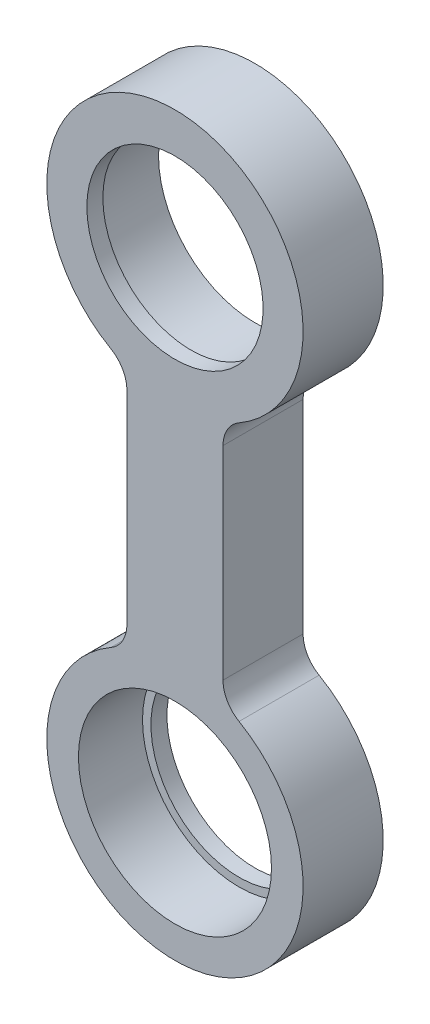
ISO-10303-21;
HEADER;
FILE_DESCRIPTION(('STEP AP214'),'2;1');
FILE_NAME('part.step','',(''),(''),'','','');
FILE_SCHEMA(('AUTOMOTIVE_DESIGN { 1 0 10303 214 1 1 1 1 }'));
ENDSEC;
DATA;
#1=APPLICATION_CONTEXT('core data for automotive mechanical design processes');
#2=APPLICATION_PROTOCOL_DEFINITION('international standard','automotive_design',2000,#1);
#3=PRODUCT_CONTEXT('',#1,'mechanical');
#4=PRODUCT('Part','Part','',(#3));
#5=PRODUCT_RELATED_PRODUCT_CATEGORY('part','',(#4));
#6=PRODUCT_DEFINITION_FORMATION('','',#4);
#7=PRODUCT_DEFINITION_CONTEXT('part definition',#1,'design');
#8=PRODUCT_DEFINITION('design','',#6,#7);
#9=PRODUCT_DEFINITION_SHAPE('','',#8);
#10=(LENGTH_UNIT() NAMED_UNIT(*) SI_UNIT(.MILLI.,.METRE.));
#11=(NAMED_UNIT(*) PLANE_ANGLE_UNIT() SI_UNIT($,.RADIAN.));
#12=(NAMED_UNIT(*) SI_UNIT($,.STERADIAN.) SOLID_ANGLE_UNIT());
#13=UNCERTAINTY_MEASURE_WITH_UNIT(LENGTH_MEASURE(1.E-05),#10,'distance_accuracy_value','');
#14=(GEOMETRIC_REPRESENTATION_CONTEXT(3) GLOBAL_UNCERTAINTY_ASSIGNED_CONTEXT((#13)) GLOBAL_UNIT_ASSIGNED_CONTEXT((#10,
#11,#12)) REPRESENTATION_CONTEXT('',''));
#15=CARTESIAN_POINT('',(0.,0.,0.));
#16=DIRECTION('',(0.,0.,1.));
#17=DIRECTION('',(1.,0.,0.));
#18=AXIS2_PLACEMENT_3D('',#15,#16,#17);
#19=CARTESIAN_POINT('',(0.,30.,5.));
#20=DIRECTION('',(0.,0.,-1.));
#21=DIRECTION('',(-1.,0.,0.));
#22=AXIS2_PLACEMENT_3D('',#19,#20,#21);
#23=CYLINDRICAL_SURFACE('',#22,8.);
#24=CARTESIAN_POINT('',(0.,30.,0.));
#25=DIRECTION('',(0.,0.,-1.));
#26=DIRECTION('',(-1.,0.,0.));
#27=AXIS2_PLACEMENT_3D('',#24,#25,#26);
#28=CIRCLE('',#27,8.);
#29=CARTESIAN_POINT('',(-4.,23.0717967697245,0.));
#30=VERTEX_POINT('',#29);
#31=CARTESIAN_POINT('',(4.,23.0717967697245,0.));
#32=VERTEX_POINT('',#31);
#33=EDGE_CURVE('E177',#30,#32,#28,.T.);
#34=ORIENTED_EDGE('',*,*,#33,.F.);
#35=DIRECTION('',(0.,0.,-1.));
#36=VECTOR('',#35,1.);
#37=CARTESIAN_POINT('',(-4.,23.0717967697245,5.));
#38=LINE('',#37,#36);
#39=CARTESIAN_POINT('',(-4.,23.0717967697245,5.));
#40=VERTEX_POINT('',#39);
#41=EDGE_CURVE('E138',#30,#40,#38,.F.);
#42=ORIENTED_EDGE('',*,*,#41,.T.);
#43=CARTESIAN_POINT('',(0.,30.,5.));
#44=DIRECTION('',(0.,0.,-1.));
#45=DIRECTION('',(-1.,0.,0.));
#46=AXIS2_PLACEMENT_3D('',#43,#44,#45);
#47=CIRCLE('',#46,8.);
#48=CARTESIAN_POINT('',(4.,23.0717967697245,5.));
#49=VERTEX_POINT('',#48);
#50=EDGE_CURVE('E125',#40,#49,#47,.T.);
#51=ORIENTED_EDGE('',*,*,#50,.T.);
#52=DIRECTION('',(0.,0.,-1.));
#53=VECTOR('',#52,1.);
#54=CARTESIAN_POINT('',(4.,23.0717967697245,5.));
#55=LINE('',#54,#53);
#56=EDGE_CURVE('E130',#49,#32,#55,.T.);
#57=ORIENTED_EDGE('',*,*,#56,.T.);
#58=EDGE_LOOP('',(#34,#42,#51,#57));
#59=FACE_BOUND('',#58,.T.);
#60=ADVANCED_FACE('F41',(#59),#23,.T.);
#61=CARTESIAN_POINT('',(-3.,7.41619848709566,5.));
#62=DIRECTION('',(-1.,0.,0.));
#63=DIRECTION('',(0.,-1.,0.));
#64=AXIS2_PLACEMENT_3D('',#61,#62,#63);
#65=PLANE('',#64);
#66=DIRECTION('',(0.,1.,0.));
#67=VECTOR('',#66,1.);
#68=CARTESIAN_POINT('',(-3.,7.41619848709566,5.));
#69=LINE('',#68,#67);
#70=CARTESIAN_POINT('',(-3.,8.66025403784439,5.));
#71=VERTEX_POINT('',#70);
#72=CARTESIAN_POINT('',(-3.,21.3397459621556,5.));
#73=VERTEX_POINT('',#72);
#74=EDGE_CURVE('E128',#71,#73,#69,.T.);
#75=ORIENTED_EDGE('',*,*,#74,.T.);
#76=DIRECTION('',(0.,0.,1.));
#77=VECTOR('',#76,1.);
#78=CARTESIAN_POINT('',(-3.,21.3397459621556,0.));
#79=LINE('',#78,#77);
#80=CARTESIAN_POINT('',(-3.,21.3397459621556,0.));
#81=VERTEX_POINT('',#80);
#82=EDGE_CURVE('E124',#73,#81,#79,.F.);
#83=ORIENTED_EDGE('',*,*,#82,.T.);
#84=DIRECTION('',(0.,1.,0.));
#85=VECTOR('',#84,1.);
#86=CARTESIAN_POINT('',(-3.,7.41619848709566,0.));
#87=LINE('',#86,#85);
#88=CARTESIAN_POINT('',(-3.,8.66025403784439,0.));
#89=VERTEX_POINT('',#88);
#90=EDGE_CURVE('E110',#89,#81,#87,.T.);
#91=ORIENTED_EDGE('',*,*,#90,.F.);
#92=DIRECTION('',(0.,0.,1.));
#93=VECTOR('',#92,1.);
#94=CARTESIAN_POINT('',(-3.,8.66025403784439,5.));
#95=LINE('',#94,#93);
#96=EDGE_CURVE('E122',#89,#71,#95,.T.);
#97=ORIENTED_EDGE('',*,*,#96,.T.);
#98=EDGE_LOOP('',(#75,#83,#91,#97));
#99=FACE_BOUND('',#98,.T.);
#100=ADVANCED_FACE('F121',(#99),#65,.T.);
#101=CARTESIAN_POINT('',(0.,0.,5.));
#102=DIRECTION('',(0.,0.,-1.));
#103=DIRECTION('',(-1.,0.,0.));
#104=AXIS2_PLACEMENT_3D('',#101,#102,#103);
#105=CYLINDRICAL_SURFACE('',#104,8.);
#106=CARTESIAN_POINT('',(0.,0.,5.));
#107=DIRECTION('',(0.,0.,-1.));
#108=DIRECTION('',(-1.,0.,0.));
#109=AXIS2_PLACEMENT_3D('',#106,#107,#108);
#110=CIRCLE('',#109,8.);
#111=CARTESIAN_POINT('',(4.,6.92820323027551,5.));
#112=VERTEX_POINT('',#111);
#113=CARTESIAN_POINT('',(-4.,6.92820323027551,5.));
#114=VERTEX_POINT('',#113);
#115=EDGE_CURVE('E132',#112,#114,#110,.T.);
#116=ORIENTED_EDGE('',*,*,#115,.T.);
#117=DIRECTION('',(0.,0.,-1.));
#118=VECTOR('',#117,1.);
#119=CARTESIAN_POINT('',(-4.,6.92820323027551,5.));
#120=LINE('',#119,#118);
#121=CARTESIAN_POINT('',(-4.,6.92820323027551,0.));
#122=VERTEX_POINT('',#121);
#123=EDGE_CURVE('E146',#114,#122,#120,.T.);
#124=ORIENTED_EDGE('',*,*,#123,.T.);
#125=CARTESIAN_POINT('',(0.,0.,0.));
#126=DIRECTION('',(0.,0.,-1.));
#127=DIRECTION('',(-1.,0.,0.));
#128=AXIS2_PLACEMENT_3D('',#125,#126,#127);
#129=CIRCLE('',#128,8.);
#130=CARTESIAN_POINT('',(4.,6.92820323027551,0.));
#131=VERTEX_POINT('',#130);
#132=EDGE_CURVE('E111',#131,#122,#129,.T.);
#133=ORIENTED_EDGE('',*,*,#132,.F.);
#134=DIRECTION('',(0.,0.,-1.));
#135=VECTOR('',#134,1.);
#136=CARTESIAN_POINT('',(4.,6.92820323027551,5.));
#137=LINE('',#136,#135);
#138=EDGE_CURVE('E63',#131,#112,#137,.F.);
#139=ORIENTED_EDGE('',*,*,#138,.T.);
#140=EDGE_LOOP('',(#116,#124,#133,#139));
#141=FACE_BOUND('',#140,.T.);
#142=ADVANCED_FACE('F160',(#141),#105,.T.);
#143=CARTESIAN_POINT('',(3.,22.5838015129043,5.));
#144=DIRECTION('',(1.,0.,0.));
#145=DIRECTION('',(0.,1.,0.));
#146=AXIS2_PLACEMENT_3D('',#143,#144,#145);
#147=PLANE('',#146);
#148=DIRECTION('',(0.,-1.,0.));
#149=VECTOR('',#148,1.);
#150=CARTESIAN_POINT('',(3.,22.5838015129043,0.));
#151=LINE('',#150,#149);
#152=CARTESIAN_POINT('',(3.,21.3397459621556,0.));
#153=VERTEX_POINT('',#152);
#154=CARTESIAN_POINT('',(3.,8.66025403784439,0.));
#155=VERTEX_POINT('',#154);
#156=EDGE_CURVE('E157',#153,#155,#151,.T.);
#157=ORIENTED_EDGE('',*,*,#156,.F.);
#158=DIRECTION('',(0.,0.,1.));
#159=VECTOR('',#158,1.);
#160=CARTESIAN_POINT('',(3.,21.3397459621556,5.));
#161=LINE('',#160,#159);
#162=CARTESIAN_POINT('',(3.,21.3397459621556,5.));
#163=VERTEX_POINT('',#162);
#164=EDGE_CURVE('E143',#153,#163,#161,.T.);
#165=ORIENTED_EDGE('',*,*,#164,.T.);
#166=DIRECTION('',(0.,-1.,0.));
#167=VECTOR('',#166,1.);
#168=CARTESIAN_POINT('',(3.,22.5838015129043,5.));
#169=LINE('',#168,#167);
#170=CARTESIAN_POINT('',(3.,8.66025403784439,5.));
#171=VERTEX_POINT('',#170);
#172=EDGE_CURVE('E166',#163,#171,#169,.T.);
#173=ORIENTED_EDGE('',*,*,#172,.T.);
#174=DIRECTION('',(0.,0.,1.));
#175=VECTOR('',#174,1.);
#176=CARTESIAN_POINT('',(3.,8.66025403784439,0.));
#177=LINE('',#176,#175);
#178=EDGE_CURVE('E140',#171,#155,#177,.F.);
#179=ORIENTED_EDGE('',*,*,#178,.T.);
#180=EDGE_LOOP('',(#157,#165,#173,#179));
#181=FACE_BOUND('',#180,.T.);
#182=ADVANCED_FACE('F169',(#181),#147,.T.);
#183=CARTESIAN_POINT('',(0.,30.,5.));
#184=DIRECTION('',(0.,0.,-1.));
#185=DIRECTION('',(-1.,0.,0.));
#186=AXIS2_PLACEMENT_3D('',#183,#184,#185);
#187=PLANE('',#186);
#188=CARTESIAN_POINT('',(0.,0.,5.));
#189=DIRECTION('',(0.,0.,1.));
#190=DIRECTION('',(1.,0.,0.));
#191=AXIS2_PLACEMENT_3D('',#188,#189,#190);
#192=CIRCLE('',#191,6.025);
#193=CARTESIAN_POINT('',(6.025,0.,5.));
#194=VERTEX_POINT('',#193);
#195=EDGE_CURVE('E204',#194,#194,#192,.T.);
#196=ORIENTED_EDGE('',*,*,#195,.F.);
#197=EDGE_LOOP('',(#196));
#198=FACE_BOUND('',#197,.T.);
#199=CARTESIAN_POINT('',(0.,30.,5.));
#200=DIRECTION('',(0.,0.,-1.));
#201=DIRECTION('',(-1.,0.,0.));
#202=AXIS2_PLACEMENT_3D('',#199,#200,#201);
#203=CIRCLE('',#202,5.50000000000001);
#204=CARTESIAN_POINT('',(-5.50000000000001,30.,5.));
#205=VERTEX_POINT('',#204);
#206=EDGE_CURVE('E180',#205,#205,#203,.T.);
#207=ORIENTED_EDGE('',*,*,#206,.T.);
#208=EDGE_LOOP('',(#207));
#209=FACE_BOUND('',#208,.T.);
#210=ORIENTED_EDGE('',*,*,#50,.F.);
#211=CARTESIAN_POINT('',(-5.,21.3397459621556,5.));
#212=DIRECTION('',(0.,0.,-1.));
#213=DIRECTION('',(-1.,0.,0.));
#214=AXIS2_PLACEMENT_3D('',#211,#212,#213);
#215=CIRCLE('',#214,2.);
#216=EDGE_CURVE('E150',#40,#73,#215,.T.);
#217=ORIENTED_EDGE('',*,*,#216,.T.);
#218=ORIENTED_EDGE('',*,*,#74,.F.);
#219=CARTESIAN_POINT('',(-5.,8.66025403784439,5.));
#220=DIRECTION('',(0.,0.,-1.));
#221=DIRECTION('',(-1.,0.,0.));
#222=AXIS2_PLACEMENT_3D('',#219,#220,#221);
#223=CIRCLE('',#222,2.);
#224=EDGE_CURVE('E56',#71,#114,#223,.T.);
#225=ORIENTED_EDGE('',*,*,#224,.T.);
#226=ORIENTED_EDGE('',*,*,#115,.F.);
#227=CARTESIAN_POINT('',(5.,8.66025403784439,5.));
#228=DIRECTION('',(0.,0.,-1.));
#229=DIRECTION('',(-1.,0.,0.));
#230=AXIS2_PLACEMENT_3D('',#227,#228,#229);
#231=CIRCLE('',#230,2.);
#232=EDGE_CURVE('E11',#112,#171,#231,.T.);
#233=ORIENTED_EDGE('',*,*,#232,.T.);
#234=ORIENTED_EDGE('',*,*,#172,.F.);
#235=CARTESIAN_POINT('',(5.,21.3397459621556,5.));
#236=DIRECTION('',(0.,0.,-1.));
#237=DIRECTION('',(-1.,0.,0.));
#238=AXIS2_PLACEMENT_3D('',#235,#236,#237);
#239=CIRCLE('',#238,2.);
#240=EDGE_CURVE('E116',#163,#49,#239,.T.);
#241=ORIENTED_EDGE('',*,*,#240,.T.);
#242=EDGE_LOOP('',(#210,#217,#218,#225,#226,#233,#234,#241));
#243=FACE_BOUND('',#242,.T.);
#244=ADVANCED_FACE('F165',(#198,#209,#243),#187,.F.);
#245=CARTESIAN_POINT('',(0.,30.,0.));
#246=DIRECTION('',(0.,0.,-1.));
#247=DIRECTION('',(-1.,0.,0.));
#248=AXIS2_PLACEMENT_3D('',#245,#246,#247);
#249=PLANE('',#248);
#250=CARTESIAN_POINT('',(0.,0.,0.));
#251=DIRECTION('',(0.,0.,1.));
#252=DIRECTION('',(1.,0.,0.));
#253=AXIS2_PLACEMENT_3D('',#250,#251,#252);
#254=CIRCLE('',#253,5.50000000000001);
#255=CARTESIAN_POINT('',(5.50000000000001,0.,0.));
#256=VERTEX_POINT('',#255);
#257=EDGE_CURVE('E195',#256,#256,#254,.T.);
#258=ORIENTED_EDGE('',*,*,#257,.T.);
#259=EDGE_LOOP('',(#258));
#260=FACE_BOUND('',#259,.T.);
#261=CARTESIAN_POINT('',(0.,30.,0.));
#262=DIRECTION('',(0.,0.,-1.));
#263=DIRECTION('',(-1.,0.,0.));
#264=AXIS2_PLACEMENT_3D('',#261,#262,#263);
#265=CIRCLE('',#264,6.025);
#266=CARTESIAN_POINT('',(-6.025,30.,0.));
#267=VERTEX_POINT('',#266);
#268=EDGE_CURVE('E192',#267,#267,#265,.T.);
#269=ORIENTED_EDGE('',*,*,#268,.F.);
#270=EDGE_LOOP('',(#269));
#271=FACE_BOUND('',#270,.T.);
#272=ORIENTED_EDGE('',*,*,#90,.T.);
#273=CARTESIAN_POINT('',(-5.,21.3397459621556,0.));
#274=DIRECTION('',(0.,0.,-1.));
#275=DIRECTION('',(-1.,0.,0.));
#276=AXIS2_PLACEMENT_3D('',#273,#274,#275);
#277=CIRCLE('',#276,2.);
#278=EDGE_CURVE('E148',#81,#30,#277,.F.);
#279=ORIENTED_EDGE('',*,*,#278,.T.);
#280=ORIENTED_EDGE('',*,*,#33,.T.);
#281=CARTESIAN_POINT('',(5.,21.3397459621556,0.));
#282=DIRECTION('',(0.,0.,-1.));
#283=DIRECTION('',(-1.,0.,0.));
#284=AXIS2_PLACEMENT_3D('',#281,#282,#283);
#285=CIRCLE('',#284,2.);
#286=EDGE_CURVE('E152',#32,#153,#285,.F.);
#287=ORIENTED_EDGE('',*,*,#286,.T.);
#288=ORIENTED_EDGE('',*,*,#156,.T.);
#289=CARTESIAN_POINT('',(5.,8.66025403784439,0.));
#290=DIRECTION('',(0.,0.,-1.));
#291=DIRECTION('',(-1.,0.,0.));
#292=AXIS2_PLACEMENT_3D('',#289,#290,#291);
#293=CIRCLE('',#292,2.);
#294=EDGE_CURVE('E49',#155,#131,#293,.F.);
#295=ORIENTED_EDGE('',*,*,#294,.T.);
#296=ORIENTED_EDGE('',*,*,#132,.T.);
#297=CARTESIAN_POINT('',(-5.,8.66025403784439,0.));
#298=DIRECTION('',(0.,0.,-1.));
#299=DIRECTION('',(-1.,0.,0.));
#300=AXIS2_PLACEMENT_3D('',#297,#298,#299);
#301=CIRCLE('',#300,2.);
#302=EDGE_CURVE('E107',#122,#89,#301,.F.);
#303=ORIENTED_EDGE('',*,*,#302,.T.);
#304=EDGE_LOOP('',(#272,#279,#280,#287,#288,#295,#296,#303));
#305=FACE_BOUND('',#304,.T.);
#306=ADVANCED_FACE('F109',(#260,#271,#305),#249,.T.);
#307=CARTESIAN_POINT('',(0.,30.,0.));
#308=DIRECTION('',(0.,0.,-1.));
#309=DIRECTION('',(-1.,0.,0.));
#310=AXIS2_PLACEMENT_3D('',#307,#308,#309);
#311=CYLINDRICAL_SURFACE('',#310,5.50000000000001);
#312=ORIENTED_EDGE('',*,*,#206,.F.);
#313=EDGE_LOOP('',(#312));
#314=FACE_BOUND('',#313,.T.);
#315=CARTESIAN_POINT('',(0.,30.,4.));
#316=DIRECTION('',(0.,0.,-1.));
#317=DIRECTION('',(-1.,0.,0.));
#318=AXIS2_PLACEMENT_3D('',#315,#316,#317);
#319=CIRCLE('',#318,5.50000000000001);
#320=CARTESIAN_POINT('',(-5.50000000000001,30.,4.));
#321=VERTEX_POINT('',#320);
#322=EDGE_CURVE('E183',#321,#321,#319,.T.);
#323=ORIENTED_EDGE('',*,*,#322,.T.);
#324=EDGE_LOOP('',(#323));
#325=FACE_BOUND('',#324,.T.);
#326=ADVANCED_FACE('F216',(#314,#325),#311,.F.);
#327=CARTESIAN_POINT('',(5.50000000000001,30.,4.));
#328=DIRECTION('',(0.,0.,1.));
#329=DIRECTION('',(1.,0.,0.));
#330=AXIS2_PLACEMENT_3D('',#327,#328,#329);
#331=PLANE('',#330);
#332=ORIENTED_EDGE('',*,*,#322,.F.);
#333=EDGE_LOOP('',(#332));
#334=FACE_BOUND('',#333,.T.);
#335=CARTESIAN_POINT('',(0.,30.,4.));
#336=DIRECTION('',(0.,0.,-1.));
#337=DIRECTION('',(-1.,0.,0.));
#338=AXIS2_PLACEMENT_3D('',#335,#336,#337);
#339=CIRCLE('',#338,6.025);
#340=CARTESIAN_POINT('',(-6.025,30.,4.));
#341=VERTEX_POINT('',#340);
#342=EDGE_CURVE('E187',#341,#341,#339,.T.);
#343=ORIENTED_EDGE('',*,*,#342,.T.);
#344=EDGE_LOOP('',(#343));
#345=FACE_BOUND('',#344,.T.);
#346=ADVANCED_FACE('F299',(#334,#345),#331,.F.);
#347=CARTESIAN_POINT('',(0.,30.,0.));
#348=DIRECTION('',(0.,0.,-1.));
#349=DIRECTION('',(-1.,0.,0.));
#350=AXIS2_PLACEMENT_3D('',#347,#348,#349);
#351=CYLINDRICAL_SURFACE('',#350,6.025);
#352=ORIENTED_EDGE('',*,*,#342,.F.);
#353=EDGE_LOOP('',(#352));
#354=FACE_BOUND('',#353,.T.);
#355=ORIENTED_EDGE('',*,*,#268,.T.);
#356=EDGE_LOOP('',(#355));
#357=FACE_BOUND('',#356,.T.);
#358=ADVANCED_FACE('F289',(#354,#357),#351,.F.);
#359=CARTESIAN_POINT('',(0.,0.,5.));
#360=DIRECTION('',(0.,0.,1.));
#361=DIRECTION('',(1.,0.,0.));
#362=AXIS2_PLACEMENT_3D('',#359,#360,#361);
#363=CYLINDRICAL_SURFACE('',#362,5.50000000000001);
#364=ORIENTED_EDGE('',*,*,#257,.F.);
#365=EDGE_LOOP('',(#364));
#366=FACE_BOUND('',#365,.T.);
#367=CARTESIAN_POINT('',(0.,0.,1.));
#368=DIRECTION('',(0.,0.,1.));
#369=DIRECTION('',(1.,0.,0.));
#370=AXIS2_PLACEMENT_3D('',#367,#368,#369);
#371=CIRCLE('',#370,5.50000000000001);
#372=CARTESIAN_POINT('',(5.50000000000001,0.,1.));
#373=VERTEX_POINT('',#372);
#374=EDGE_CURVE('E198',#373,#373,#371,.T.);
#375=ORIENTED_EDGE('',*,*,#374,.T.);
#376=EDGE_LOOP('',(#375));
#377=FACE_BOUND('',#376,.T.);
#378=ADVANCED_FACE('F279',(#366,#377),#363,.F.);
#379=CARTESIAN_POINT('',(5.50000000000001,0.,1.));
#380=DIRECTION('',(0.,0.,-1.));
#381=DIRECTION('',(-1.,0.,0.));
#382=AXIS2_PLACEMENT_3D('',#379,#380,#381);
#383=PLANE('',#382);
#384=ORIENTED_EDGE('',*,*,#374,.F.);
#385=EDGE_LOOP('',(#384));
#386=FACE_BOUND('',#385,.T.);
#387=CARTESIAN_POINT('',(0.,0.,1.));
#388=DIRECTION('',(0.,0.,1.));
#389=DIRECTION('',(1.,0.,0.));
#390=AXIS2_PLACEMENT_3D('',#387,#388,#389);
#391=CIRCLE('',#390,6.025);
#392=CARTESIAN_POINT('',(6.025,0.,1.));
#393=VERTEX_POINT('',#392);
#394=EDGE_CURVE('E201',#393,#393,#391,.T.);
#395=ORIENTED_EDGE('',*,*,#394,.T.);
#396=EDGE_LOOP('',(#395));
#397=FACE_BOUND('',#396,.T.);
#398=ADVANCED_FACE('F269',(#386,#397),#383,.F.);
#399=CARTESIAN_POINT('',(0.,0.,5.));
#400=DIRECTION('',(0.,0.,1.));
#401=DIRECTION('',(1.,0.,0.));
#402=AXIS2_PLACEMENT_3D('',#399,#400,#401);
#403=CYLINDRICAL_SURFACE('',#402,6.025);
#404=ORIENTED_EDGE('',*,*,#394,.F.);
#405=EDGE_LOOP('',(#404));
#406=FACE_BOUND('',#405,.T.);
#407=ORIENTED_EDGE('',*,*,#195,.T.);
#408=EDGE_LOOP('',(#407));
#409=FACE_BOUND('',#408,.T.);
#410=ADVANCED_FACE('F208',(#406,#409),#403,.F.);
#411=CARTESIAN_POINT('',(-5.,21.3397459621556,5.));
#412=DIRECTION('',(0.,0.,-1.));
#413=DIRECTION('',(-1.,0.,0.));
#414=AXIS2_PLACEMENT_3D('',#411,#412,#413);
#415=CYLINDRICAL_SURFACE('',#414,2.);
#416=ORIENTED_EDGE('',*,*,#216,.F.);
#417=ORIENTED_EDGE('',*,*,#41,.F.);
#418=ORIENTED_EDGE('',*,*,#278,.F.);
#419=ORIENTED_EDGE('',*,*,#82,.F.);
#420=EDGE_LOOP('',(#416,#417,#418,#419));
#421=FACE_BOUND('',#420,.T.);
#422=ADVANCED_FACE('F231',(#421),#415,.F.);
#423=CARTESIAN_POINT('',(5.,21.3397459621556,5.));
#424=DIRECTION('',(0.,0.,-1.));
#425=DIRECTION('',(-1.,0.,0.));
#426=AXIS2_PLACEMENT_3D('',#423,#424,#425);
#427=CYLINDRICAL_SURFACE('',#426,2.);
#428=ORIENTED_EDGE('',*,*,#240,.F.);
#429=ORIENTED_EDGE('',*,*,#164,.F.);
#430=ORIENTED_EDGE('',*,*,#286,.F.);
#431=ORIENTED_EDGE('',*,*,#56,.F.);
#432=EDGE_LOOP('',(#428,#429,#430,#431));
#433=FACE_BOUND('',#432,.T.);
#434=ADVANCED_FACE('F234',(#433),#427,.F.);
#435=CARTESIAN_POINT('',(-5.,8.66025403784439,5.));
#436=DIRECTION('',(0.,0.,-1.));
#437=DIRECTION('',(-1.,0.,0.));
#438=AXIS2_PLACEMENT_3D('',#435,#436,#437);
#439=CYLINDRICAL_SURFACE('',#438,2.);
#440=ORIENTED_EDGE('',*,*,#224,.F.);
#441=ORIENTED_EDGE('',*,*,#96,.F.);
#442=ORIENTED_EDGE('',*,*,#302,.F.);
#443=ORIENTED_EDGE('',*,*,#123,.F.);
#444=EDGE_LOOP('',(#440,#441,#442,#443));
#445=FACE_BOUND('',#444,.T.);
#446=ADVANCED_FACE('F127',(#445),#439,.F.);
#447=CARTESIAN_POINT('',(5.,8.66025403784439,5.));
#448=DIRECTION('',(0.,0.,-1.));
#449=DIRECTION('',(-1.,0.,0.));
#450=AXIS2_PLACEMENT_3D('',#447,#448,#449);
#451=CYLINDRICAL_SURFACE('',#450,2.);
#452=ORIENTED_EDGE('',*,*,#232,.F.);
#453=ORIENTED_EDGE('',*,*,#138,.F.);
#454=ORIENTED_EDGE('',*,*,#294,.F.);
#455=ORIENTED_EDGE('',*,*,#178,.F.);
#456=EDGE_LOOP('',(#452,#453,#454,#455));
#457=FACE_BOUND('',#456,.T.);
#458=ADVANCED_FACE('F43',(#457),#451,.F.);
#459=CLOSED_SHELL('',(#60,#100,#142,#182,#244,#306,#326,#346,#358,#378,#398,#410,#422,#434,#446,#458));
#460=MANIFOLD_SOLID_BREP('B2',#459);
#461=ADVANCED_BREP_SHAPE_REPRESENTATION('',(#18,#460),#14);
#462=SHAPE_DEFINITION_REPRESENTATION(#9,#461);
ENDSEC;
END-ISO-10303-21;
